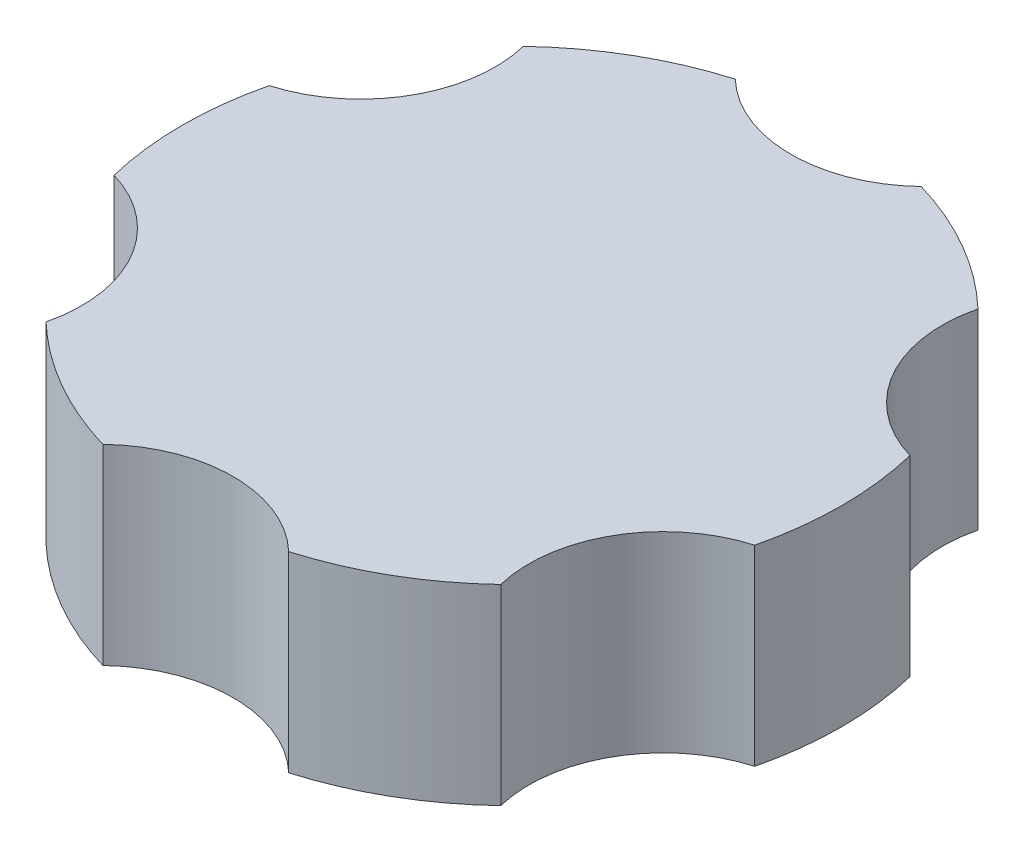
ISO-10303-21;
HEADER;
FILE_DESCRIPTION(('STEP AP214'),'2;1');
FILE_NAME('part.step','',(''),(''),'','','');
FILE_SCHEMA(('AUTOMOTIVE_DESIGN { 1 0 10303 214 1 1 1 1 }'));
ENDSEC;
DATA;
#1=APPLICATION_CONTEXT('core data for automotive mechanical design processes');
#2=APPLICATION_PROTOCOL_DEFINITION('international standard','automotive_design',2000,#1);
#3=PRODUCT_CONTEXT('',#1,'mechanical');
#4=PRODUCT('Part','Part','',(#3));
#5=PRODUCT_RELATED_PRODUCT_CATEGORY('part','',(#4));
#6=PRODUCT_DEFINITION_FORMATION('','',#4);
#7=PRODUCT_DEFINITION_CONTEXT('part definition',#1,'design');
#8=PRODUCT_DEFINITION('design','',#6,#7);
#9=PRODUCT_DEFINITION_SHAPE('','',#8);
#10=(LENGTH_UNIT() NAMED_UNIT(*) SI_UNIT(.MILLI.,.METRE.));
#11=(NAMED_UNIT(*) PLANE_ANGLE_UNIT() SI_UNIT($,.RADIAN.));
#12=(NAMED_UNIT(*) SI_UNIT($,.STERADIAN.) SOLID_ANGLE_UNIT());
#13=UNCERTAINTY_MEASURE_WITH_UNIT(LENGTH_MEASURE(1.E-05),#10,'distance_accuracy_value','');
#14=(GEOMETRIC_REPRESENTATION_CONTEXT(3) GLOBAL_UNCERTAINTY_ASSIGNED_CONTEXT((#13)) GLOBAL_UNIT_ASSIGNED_CONTEXT((#10,
#11,#12)) REPRESENTATION_CONTEXT('',''));
#15=CARTESIAN_POINT('',(0.,0.,0.));
#16=DIRECTION('',(0.,0.,1.));
#17=DIRECTION('',(1.,0.,0.));
#18=AXIS2_PLACEMENT_3D('',#15,#16,#17);
#19=CARTESIAN_POINT('',(0.,17.,0.));
#20=DIRECTION('',(0.,-1.,0.));
#21=DIRECTION('',(0.,0.,-1.));
#22=AXIS2_PLACEMENT_3D('',#19,#20,#21);
#23=CYLINDRICAL_SURFACE('',#22,29.25);
#24=CARTESIAN_POINT('',(0.,0.,0.));
#25=DIRECTION('',(0.,1.,0.));
#26=DIRECTION('',(0.,0.,1.));
#27=AXIS2_PLACEMENT_3D('',#24,#25,#26);
#28=CIRCLE('',#27,29.25);
#29=CARTESIAN_POINT('',(-8.25,0.,-28.0624304008046));
#30=VERTEX_POINT('',#29);
#31=CARTESIAN_POINT('',(-20.1777776190296,0.,-21.1759247816238));
#32=VERTEX_POINT('',#31);
#33=EDGE_CURVE('E153',#30,#32,#28,.T.);
#34=ORIENTED_EDGE('',*,*,#33,.T.);
#35=DIRECTION('',(0.,-1.,0.));
#36=VECTOR('',#35,1.);
#37=CARTESIAN_POINT('',(-20.1777776190296,17.,-21.1759247816238));
#38=LINE('',#37,#36);
#39=CARTESIAN_POINT('',(-20.1777776190296,17.,-21.1759247816238));
#40=VERTEX_POINT('',#39);
#41=EDGE_CURVE('E11',#40,#32,#38,.T.);
#42=ORIENTED_EDGE('',*,*,#41,.F.);
#43=CARTESIAN_POINT('',(0.,17.,0.));
#44=DIRECTION('',(0.,1.,0.));
#45=DIRECTION('',(0.,0.,1.));
#46=AXIS2_PLACEMENT_3D('',#43,#44,#45);
#47=CIRCLE('',#46,29.25);
#48=CARTESIAN_POINT('',(-8.25,17.,-28.0624304008046));
#49=VERTEX_POINT('',#48);
#50=EDGE_CURVE('E175',#49,#40,#47,.T.);
#51=ORIENTED_EDGE('',*,*,#50,.F.);
#52=DIRECTION('',(0.,-1.,0.));
#53=VECTOR('',#52,1.);
#54=CARTESIAN_POINT('',(-8.25,17.,-28.0624304008046));
#55=LINE('',#54,#53);
#56=EDGE_CURVE('E149',#49,#30,#55,.T.);
#57=ORIENTED_EDGE('',*,*,#56,.T.);
#58=EDGE_LOOP('',(#34,#42,#51,#57));
#59=FACE_BOUND('',#58,.T.);
#60=ADVANCED_FACE('F33',(#59),#23,.T.);
#61=CARTESIAN_POINT('',(-31.765825640971,17.,-18.3400079848448));
#62=DIRECTION('',(0.,-1.,0.));
#63=DIRECTION('',(0.,0.,-1.));
#64=AXIS2_PLACEMENT_3D('',#61,#62,#63);
#65=CYLINDRICAL_SURFACE('',#64,11.9300159696906);
#66=CARTESIAN_POINT('',(-31.765825640971,0.,-18.3400079848448));
#67=DIRECTION('',(0.,-1.,0.));
#68=DIRECTION('',(0.,0.,1.));
#69=AXIS2_PLACEMENT_3D('',#66,#67,#68);
#70=CIRCLE('',#69,11.9300159696906);
#71=CARTESIAN_POINT('',(-28.4277776190296,0.,-6.88650561918018));
#72=VERTEX_POINT('',#71);
#73=EDGE_CURVE('E156',#32,#72,#70,.T.);
#74=ORIENTED_EDGE('',*,*,#73,.T.);
#75=DIRECTION('',(0.,-1.,0.));
#76=VECTOR('',#75,1.);
#77=CARTESIAN_POINT('',(-28.4277776190296,17.,-6.88650561918018));
#78=LINE('',#77,#76);
#79=CARTESIAN_POINT('',(-28.4277776190296,17.,-6.88650561918018));
#80=VERTEX_POINT('',#79);
#81=EDGE_CURVE('E41',#80,#72,#78,.T.);
#82=ORIENTED_EDGE('',*,*,#81,.F.);
#83=CARTESIAN_POINT('',(-31.765825640971,17.,-18.3400079848448));
#84=DIRECTION('',(0.,-1.,0.));
#85=DIRECTION('',(0.,0.,1.));
#86=AXIS2_PLACEMENT_3D('',#83,#84,#85);
#87=CIRCLE('',#86,11.9300159696906);
#88=EDGE_CURVE('E104',#40,#80,#87,.T.);
#89=ORIENTED_EDGE('',*,*,#88,.F.);
#90=ORIENTED_EDGE('',*,*,#41,.T.);
#91=EDGE_LOOP('',(#74,#82,#89,#90));
#92=FACE_BOUND('',#91,.T.);
#93=ADVANCED_FACE('F253',(#92),#65,.F.);
#94=CARTESIAN_POINT('',(0.,17.,0.));
#95=DIRECTION('',(0.,-1.,0.));
#96=DIRECTION('',(0.,0.,-1.));
#97=AXIS2_PLACEMENT_3D('',#94,#95,#96);
#98=CYLINDRICAL_SURFACE('',#97,29.25);
#99=CARTESIAN_POINT('',(0.,0.,0.));
#100=DIRECTION('',(0.,1.,0.));
#101=DIRECTION('',(0.,0.,1.));
#102=AXIS2_PLACEMENT_3D('',#99,#100,#101);
#103=CIRCLE('',#102,29.25);
#104=CARTESIAN_POINT('',(-28.4277776190293,0.,6.88650561918127));
#105=VERTEX_POINT('',#104);
#106=EDGE_CURVE('E158',#72,#105,#103,.T.);
#107=ORIENTED_EDGE('',*,*,#106,.T.);
#108=DIRECTION('',(0.,-1.,0.));
#109=VECTOR('',#108,1.);
#110=CARTESIAN_POINT('',(-28.4277776190293,17.,6.88650561918127));
#111=LINE('',#110,#109);
#112=CARTESIAN_POINT('',(-28.4277776190293,17.,6.88650561918127));
#113=VERTEX_POINT('',#112);
#114=EDGE_CURVE('E194',#113,#105,#111,.T.);
#115=ORIENTED_EDGE('',*,*,#114,.F.);
#116=CARTESIAN_POINT('',(0.,17.,0.));
#117=DIRECTION('',(0.,1.,0.));
#118=DIRECTION('',(0.,0.,1.));
#119=AXIS2_PLACEMENT_3D('',#116,#117,#118);
#120=CIRCLE('',#119,29.25);
#121=EDGE_CURVE('E202',#80,#113,#120,.T.);
#122=ORIENTED_EDGE('',*,*,#121,.F.);
#123=ORIENTED_EDGE('',*,*,#81,.T.);
#124=EDGE_LOOP('',(#107,#115,#122,#123));
#125=FACE_BOUND('',#124,.T.);
#126=ADVANCED_FACE('F200',(#125),#98,.T.);
#127=CARTESIAN_POINT('',(-31.7658256409706,17.,18.340007984846));
#128=DIRECTION('',(0.,-1.,0.));
#129=DIRECTION('',(0.,0.,-1.));
#130=AXIS2_PLACEMENT_3D('',#127,#128,#129);
#131=CYLINDRICAL_SURFACE('',#130,11.9300159696906);
#132=CARTESIAN_POINT('',(-31.7658256409706,0.,18.340007984846));
#133=DIRECTION('',(0.,-1.,0.));
#134=DIRECTION('',(0.,0.,1.));
#135=AXIS2_PLACEMENT_3D('',#132,#133,#134);
#136=CIRCLE('',#135,11.9300159696906);
#137=CARTESIAN_POINT('',(-20.177777619029,0.,21.1759247816243));
#138=VERTEX_POINT('',#137);
#139=EDGE_CURVE('E160',#105,#138,#136,.T.);
#140=ORIENTED_EDGE('',*,*,#139,.T.);
#141=DIRECTION('',(0.,-1.,0.));
#142=VECTOR('',#141,1.);
#143=CARTESIAN_POINT('',(-20.177777619029,17.,21.1759247816243));
#144=LINE('',#143,#142);
#145=CARTESIAN_POINT('',(-20.177777619029,17.,21.1759247816243));
#146=VERTEX_POINT('',#145);
#147=EDGE_CURVE('E191',#146,#138,#144,.T.);
#148=ORIENTED_EDGE('',*,*,#147,.F.);
#149=CARTESIAN_POINT('',(-31.7658256409706,17.,18.340007984846));
#150=DIRECTION('',(0.,-1.,0.));
#151=DIRECTION('',(0.,0.,1.));
#152=AXIS2_PLACEMENT_3D('',#149,#150,#151);
#153=CIRCLE('',#152,11.9300159696906);
#154=EDGE_CURVE('E220',#113,#146,#153,.T.);
#155=ORIENTED_EDGE('',*,*,#154,.F.);
#156=ORIENTED_EDGE('',*,*,#114,.T.);
#157=EDGE_LOOP('',(#140,#148,#155,#156));
#158=FACE_BOUND('',#157,.T.);
#159=ADVANCED_FACE('F211',(#158),#131,.F.);
#160=CARTESIAN_POINT('',(0.,17.,0.));
#161=DIRECTION('',(0.,-1.,0.));
#162=DIRECTION('',(0.,0.,-1.));
#163=AXIS2_PLACEMENT_3D('',#160,#161,#162);
#164=CYLINDRICAL_SURFACE('',#163,29.25);
#165=CARTESIAN_POINT('',(0.,0.,0.));
#166=DIRECTION('',(0.,1.,0.));
#167=DIRECTION('',(0.,0.,1.));
#168=AXIS2_PLACEMENT_3D('',#165,#166,#167);
#169=CIRCLE('',#168,29.25);
#170=CARTESIAN_POINT('',(-8.24999999999903,0.,28.0624304008048));
#171=VERTEX_POINT('',#170);
#172=EDGE_CURVE('E162',#138,#171,#169,.T.);
#173=ORIENTED_EDGE('',*,*,#172,.T.);
#174=DIRECTION('',(0.,-1.,0.));
#175=VECTOR('',#174,1.);
#176=CARTESIAN_POINT('',(-8.24999999999903,17.,28.0624304008048));
#177=LINE('',#176,#175);
#178=CARTESIAN_POINT('',(-8.24999999999903,17.,28.0624304008048));
#179=VERTEX_POINT('',#178);
#180=EDGE_CURVE('E188',#179,#171,#177,.T.);
#181=ORIENTED_EDGE('',*,*,#180,.F.);
#182=CARTESIAN_POINT('',(0.,17.,0.));
#183=DIRECTION('',(0.,1.,0.));
#184=DIRECTION('',(0.,0.,1.));
#185=AXIS2_PLACEMENT_3D('',#182,#183,#184);
#186=CIRCLE('',#185,29.25);
#187=EDGE_CURVE('E217',#146,#179,#186,.T.);
#188=ORIENTED_EDGE('',*,*,#187,.F.);
#189=ORIENTED_EDGE('',*,*,#147,.T.);
#190=EDGE_LOOP('',(#173,#181,#188,#189));
#191=FACE_BOUND('',#190,.T.);
#192=ADVANCED_FACE('F215',(#191),#164,.T.);
#193=CARTESIAN_POINT('',(7.78228973605211E-13,17.,36.6800159696911));
#194=DIRECTION('',(0.,-1.,0.));
#195=DIRECTION('',(0.,0.,-1.));
#196=AXIS2_PLACEMENT_3D('',#193,#194,#195);
#197=CYLINDRICAL_SURFACE('',#196,11.9300159696906);
#198=CARTESIAN_POINT('',(7.78228973605211E-13,0.,36.6800159696911));
#199=DIRECTION('',(0.,-1.,0.));
#200=DIRECTION('',(0.,0.,1.));
#201=AXIS2_PLACEMENT_3D('',#198,#199,#200);
#202=CIRCLE('',#201,11.9300159696906);
#203=CARTESIAN_POINT('',(8.25000000000022,0.,28.0624304008045));
#204=VERTEX_POINT('',#203);
#205=EDGE_CURVE('E164',#171,#204,#202,.T.);
#206=ORIENTED_EDGE('',*,*,#205,.T.);
#207=DIRECTION('',(0.,-1.,0.));
#208=VECTOR('',#207,1.);
#209=CARTESIAN_POINT('',(8.25000000000022,17.,28.0624304008045));
#210=LINE('',#209,#208);
#211=CARTESIAN_POINT('',(8.25000000000022,17.,28.0624304008045));
#212=VERTEX_POINT('',#211);
#213=EDGE_CURVE('E185',#212,#204,#210,.T.);
#214=ORIENTED_EDGE('',*,*,#213,.F.);
#215=CARTESIAN_POINT('',(7.78228973605211E-13,17.,36.6800159696911));
#216=DIRECTION('',(0.,-1.,0.));
#217=DIRECTION('',(0.,0.,1.));
#218=AXIS2_PLACEMENT_3D('',#215,#216,#217);
#219=CIRCLE('',#218,11.9300159696906);
#220=EDGE_CURVE('E219',#179,#212,#219,.T.);
#221=ORIENTED_EDGE('',*,*,#220,.F.);
#222=ORIENTED_EDGE('',*,*,#180,.T.);
#223=EDGE_LOOP('',(#206,#214,#221,#222));
#224=FACE_BOUND('',#223,.T.);
#225=ADVANCED_FACE('F266',(#224),#197,.F.);
#226=CARTESIAN_POINT('',(0.,17.,0.));
#227=DIRECTION('',(0.,-1.,0.));
#228=DIRECTION('',(0.,0.,-1.));
#229=AXIS2_PLACEMENT_3D('',#226,#227,#228);
#230=CYLINDRICAL_SURFACE('',#229,29.25);
#231=CARTESIAN_POINT('',(0.,0.,0.));
#232=DIRECTION('',(0.,1.,0.));
#233=DIRECTION('',(0.,0.,1.));
#234=AXIS2_PLACEMENT_3D('',#231,#232,#233);
#235=CIRCLE('',#234,29.25);
#236=CARTESIAN_POINT('',(20.1777776190301,0.,21.1759247816233));
#237=VERTEX_POINT('',#236);
#238=EDGE_CURVE('E166',#204,#237,#235,.T.);
#239=ORIENTED_EDGE('',*,*,#238,.T.);
#240=DIRECTION('',(0.,-1.,0.));
#241=VECTOR('',#240,1.);
#242=CARTESIAN_POINT('',(20.1777776190301,17.,21.1759247816233));
#243=LINE('',#242,#241);
#244=CARTESIAN_POINT('',(20.1777776190301,17.,21.1759247816233));
#245=VERTEX_POINT('',#244);
#246=EDGE_CURVE('E182',#245,#237,#243,.T.);
#247=ORIENTED_EDGE('',*,*,#246,.F.);
#248=CARTESIAN_POINT('',(0.,17.,0.));
#249=DIRECTION('',(0.,1.,0.));
#250=DIRECTION('',(0.,0.,1.));
#251=AXIS2_PLACEMENT_3D('',#248,#249,#250);
#252=CIRCLE('',#251,29.25);
#253=EDGE_CURVE('E222',#212,#245,#252,.T.);
#254=ORIENTED_EDGE('',*,*,#253,.F.);
#255=ORIENTED_EDGE('',*,*,#213,.T.);
#256=EDGE_LOOP('',(#239,#247,#254,#255));
#257=FACE_BOUND('',#256,.T.);
#258=ADVANCED_FACE('F269',(#257),#230,.T.);
#259=CARTESIAN_POINT('',(31.7658256409718,17.,18.3400079848453));
#260=DIRECTION('',(0.,-1.,0.));
#261=DIRECTION('',(0.,0.,-1.));
#262=AXIS2_PLACEMENT_3D('',#259,#260,#261);
#263=CYLINDRICAL_SURFACE('',#262,11.9300159696906);
#264=CARTESIAN_POINT('',(31.7658256409718,0.,18.3400079848453));
#265=DIRECTION('',(0.,-1.,0.));
#266=DIRECTION('',(0.,0.,1.));
#267=AXIS2_PLACEMENT_3D('',#264,#265,#266);
#268=CIRCLE('',#267,11.9300159696906);
#269=CARTESIAN_POINT('',(28.4277776190294,0.,6.88650561918091));
#270=VERTEX_POINT('',#269);
#271=EDGE_CURVE('E168',#237,#270,#268,.T.);
#272=ORIENTED_EDGE('',*,*,#271,.T.);
#273=DIRECTION('',(0.,-1.,0.));
#274=VECTOR('',#273,1.);
#275=CARTESIAN_POINT('',(28.4277776190294,17.,6.88650561918091));
#276=LINE('',#275,#274);
#277=CARTESIAN_POINT('',(28.4277776190294,17.,6.88650561918091));
#278=VERTEX_POINT('',#277);
#279=EDGE_CURVE('E179',#278,#270,#276,.T.);
#280=ORIENTED_EDGE('',*,*,#279,.F.);
#281=CARTESIAN_POINT('',(31.7658256409718,17.,18.3400079848453));
#282=DIRECTION('',(0.,-1.,0.));
#283=DIRECTION('',(0.,0.,1.));
#284=AXIS2_PLACEMENT_3D('',#281,#282,#283);
#285=CIRCLE('',#284,11.9300159696906);
#286=EDGE_CURVE('E228',#245,#278,#285,.T.);
#287=ORIENTED_EDGE('',*,*,#286,.F.);
#288=ORIENTED_EDGE('',*,*,#246,.T.);
#289=EDGE_LOOP('',(#272,#280,#287,#288));
#290=FACE_BOUND('',#289,.T.);
#291=ADVANCED_FACE('F234',(#290),#263,.F.);
#292=CARTESIAN_POINT('',(0.,17.,0.));
#293=DIRECTION('',(0.,-1.,0.));
#294=DIRECTION('',(0.,0.,-1.));
#295=AXIS2_PLACEMENT_3D('',#292,#293,#294);
#296=CYLINDRICAL_SURFACE('',#295,29.25);
#297=CARTESIAN_POINT('',(0.,0.,0.));
#298=DIRECTION('',(0.,1.,0.));
#299=DIRECTION('',(0.,0.,1.));
#300=AXIS2_PLACEMENT_3D('',#297,#298,#299);
#301=CIRCLE('',#300,29.25);
#302=CARTESIAN_POINT('',(28.4277776190294,0.,-6.88650561918104));
#303=VERTEX_POINT('',#302);
#304=EDGE_CURVE('E170',#270,#303,#301,.T.);
#305=ORIENTED_EDGE('',*,*,#304,.T.);
#306=DIRECTION('',(0.,-1.,0.));
#307=VECTOR('',#306,1.);
#308=CARTESIAN_POINT('',(28.4277776190294,17.,-6.88650561918104));
#309=LINE('',#308,#307);
#310=CARTESIAN_POINT('',(28.4277776190294,17.,-6.88650561918104));
#311=VERTEX_POINT('',#310);
#312=EDGE_CURVE('E144',#311,#303,#309,.T.);
#313=ORIENTED_EDGE('',*,*,#312,.F.);
#314=CARTESIAN_POINT('',(0.,17.,0.));
#315=DIRECTION('',(0.,1.,0.));
#316=DIRECTION('',(0.,0.,1.));
#317=AXIS2_PLACEMENT_3D('',#314,#315,#316);
#318=CIRCLE('',#317,29.25);
#319=EDGE_CURVE('E135',#278,#311,#318,.T.);
#320=ORIENTED_EDGE('',*,*,#319,.F.);
#321=ORIENTED_EDGE('',*,*,#279,.T.);
#322=EDGE_LOOP('',(#305,#313,#320,#321));
#323=FACE_BOUND('',#322,.T.);
#324=ADVANCED_FACE('F238',(#323),#296,.T.);
#325=CARTESIAN_POINT('',(31.7658256409714,17.,-18.3400079848455));
#326=DIRECTION('',(0.,-1.,0.));
#327=DIRECTION('',(0.,0.,-1.));
#328=AXIS2_PLACEMENT_3D('',#325,#326,#327);
#329=CYLINDRICAL_SURFACE('',#328,11.9300159696906);
#330=CARTESIAN_POINT('',(31.7658256409714,0.,-18.3400079848455));
#331=DIRECTION('',(0.,-1.,0.));
#332=DIRECTION('',(0.,0.,1.));
#333=AXIS2_PLACEMENT_3D('',#330,#331,#332);
#334=CIRCLE('',#333,11.9300159696906);
#335=CARTESIAN_POINT('',(20.1777776190298,0.,-21.1759247816236));
#336=VERTEX_POINT('',#335);
#337=EDGE_CURVE('E143',#303,#336,#334,.T.);
#338=ORIENTED_EDGE('',*,*,#337,.T.);
#339=DIRECTION('',(0.,-1.,0.));
#340=VECTOR('',#339,1.);
#341=CARTESIAN_POINT('',(20.1777776190298,17.,-21.1759247816236));
#342=LINE('',#341,#340);
#343=CARTESIAN_POINT('',(20.1777776190298,17.,-21.1759247816236));
#344=VERTEX_POINT('',#343);
#345=EDGE_CURVE('E140',#344,#336,#342,.T.);
#346=ORIENTED_EDGE('',*,*,#345,.F.);
#347=CARTESIAN_POINT('',(31.7658256409714,17.,-18.3400079848455));
#348=DIRECTION('',(0.,-1.,0.));
#349=DIRECTION('',(0.,0.,1.));
#350=AXIS2_PLACEMENT_3D('',#347,#348,#349);
#351=CIRCLE('',#350,11.9300159696906);
#352=EDGE_CURVE('E129',#311,#344,#351,.T.);
#353=ORIENTED_EDGE('',*,*,#352,.F.);
#354=ORIENTED_EDGE('',*,*,#312,.T.);
#355=EDGE_LOOP('',(#338,#346,#353,#354));
#356=FACE_BOUND('',#355,.T.);
#357=ADVANCED_FACE('F141',(#356),#329,.F.);
#358=CARTESIAN_POINT('',(0.,17.,0.));
#359=DIRECTION('',(0.,-1.,0.));
#360=DIRECTION('',(0.,0.,-1.));
#361=AXIS2_PLACEMENT_3D('',#358,#359,#360);
#362=CYLINDRICAL_SURFACE('',#361,29.25);
#363=CARTESIAN_POINT('',(0.,0.,0.));
#364=DIRECTION('',(0.,1.,0.));
#365=DIRECTION('',(0.,0.,1.));
#366=AXIS2_PLACEMENT_3D('',#363,#364,#365);
#367=CIRCLE('',#366,29.25);
#368=CARTESIAN_POINT('',(8.25,0.,-28.0624304008046));
#369=VERTEX_POINT('',#368);
#370=EDGE_CURVE('E90',#336,#369,#367,.T.);
#371=ORIENTED_EDGE('',*,*,#370,.T.);
#372=DIRECTION('',(0.,-1.,0.));
#373=VECTOR('',#372,1.);
#374=CARTESIAN_POINT('',(8.25,17.,-28.0624304008046));
#375=LINE('',#374,#373);
#376=CARTESIAN_POINT('',(8.25,17.,-28.0624304008046));
#377=VERTEX_POINT('',#376);
#378=EDGE_CURVE('E145',#377,#369,#375,.T.);
#379=ORIENTED_EDGE('',*,*,#378,.F.);
#380=CARTESIAN_POINT('',(0.,17.,0.));
#381=DIRECTION('',(0.,1.,0.));
#382=DIRECTION('',(0.,0.,1.));
#383=AXIS2_PLACEMENT_3D('',#380,#381,#382);
#384=CIRCLE('',#383,29.25);
#385=EDGE_CURVE('E133',#344,#377,#384,.T.);
#386=ORIENTED_EDGE('',*,*,#385,.F.);
#387=ORIENTED_EDGE('',*,*,#345,.T.);
#388=EDGE_LOOP('',(#371,#379,#386,#387));
#389=FACE_BOUND('',#388,.T.);
#390=ADVANCED_FACE('F147',(#389),#362,.T.);
#391=CARTESIAN_POINT('',(0.,17.,-36.6800159696906));
#392=DIRECTION('',(0.,-1.,0.));
#393=DIRECTION('',(0.,0.,-1.));
#394=AXIS2_PLACEMENT_3D('',#391,#392,#393);
#395=CYLINDRICAL_SURFACE('',#394,11.9300159696906);
#396=CARTESIAN_POINT('',(0.,0.,-36.6800159696906));
#397=DIRECTION('',(0.,-1.,0.));
#398=DIRECTION('',(0.,0.,1.));
#399=AXIS2_PLACEMENT_3D('',#396,#397,#398);
#400=CIRCLE('',#399,11.9300159696906);
#401=EDGE_CURVE('E96',#369,#30,#400,.T.);
#402=ORIENTED_EDGE('',*,*,#401,.T.);
#403=ORIENTED_EDGE('',*,*,#56,.F.);
#404=CARTESIAN_POINT('',(0.,17.,-36.6800159696906));
#405=DIRECTION('',(0.,-1.,0.));
#406=DIRECTION('',(0.,0.,1.));
#407=AXIS2_PLACEMENT_3D('',#404,#405,#406);
#408=CIRCLE('',#407,11.9300159696906);
#409=EDGE_CURVE('E49',#377,#49,#408,.T.);
#410=ORIENTED_EDGE('',*,*,#409,.F.);
#411=ORIENTED_EDGE('',*,*,#378,.T.);
#412=EDGE_LOOP('',(#402,#403,#410,#411));
#413=FACE_BOUND('',#412,.T.);
#414=ADVANCED_FACE('F242',(#413),#395,.F.);
#415=CARTESIAN_POINT('',(-15.8829128204855,17.,-9.17000399242242));
#416=DIRECTION('',(0.,1.,0.));
#417=DIRECTION('',(0.,0.,1.));
#418=AXIS2_PLACEMENT_3D('',#415,#416,#417);
#419=PLANE('',#418);
#420=ORIENTED_EDGE('',*,*,#50,.T.);
#421=ORIENTED_EDGE('',*,*,#88,.T.);
#422=ORIENTED_EDGE('',*,*,#121,.T.);
#423=ORIENTED_EDGE('',*,*,#154,.T.);
#424=ORIENTED_EDGE('',*,*,#187,.T.);
#425=ORIENTED_EDGE('',*,*,#220,.T.);
#426=ORIENTED_EDGE('',*,*,#253,.T.);
#427=ORIENTED_EDGE('',*,*,#286,.T.);
#428=ORIENTED_EDGE('',*,*,#319,.T.);
#429=ORIENTED_EDGE('',*,*,#352,.T.);
#430=ORIENTED_EDGE('',*,*,#385,.T.);
#431=ORIENTED_EDGE('',*,*,#409,.T.);
#432=EDGE_LOOP('',(#420,#421,#422,#423,#424,#425,#426,#427,#428,#429,#430,#431));
#433=FACE_BOUND('',#432,.T.);
#434=ADVANCED_FACE('F131',(#433),#419,.T.);
#435=CARTESIAN_POINT('',(-15.8829128204855,0.,-9.17000399242242));
#436=DIRECTION('',(0.,1.,0.));
#437=DIRECTION('',(0.,0.,1.));
#438=AXIS2_PLACEMENT_3D('',#435,#436,#437);
#439=PLANE('',#438);
#440=ORIENTED_EDGE('',*,*,#33,.F.);
#441=ORIENTED_EDGE('',*,*,#401,.F.);
#442=ORIENTED_EDGE('',*,*,#370,.F.);
#443=ORIENTED_EDGE('',*,*,#337,.F.);
#444=ORIENTED_EDGE('',*,*,#304,.F.);
#445=ORIENTED_EDGE('',*,*,#271,.F.);
#446=ORIENTED_EDGE('',*,*,#238,.F.);
#447=ORIENTED_EDGE('',*,*,#205,.F.);
#448=ORIENTED_EDGE('',*,*,#172,.F.);
#449=ORIENTED_EDGE('',*,*,#139,.F.);
#450=ORIENTED_EDGE('',*,*,#106,.F.);
#451=ORIENTED_EDGE('',*,*,#73,.F.);
#452=EDGE_LOOP('',(#440,#441,#442,#443,#444,#445,#446,#447,#448,#449,#450,#451));
#453=FACE_BOUND('',#452,.T.);
#454=ADVANCED_FACE('F206',(#453),#439,.F.);
#455=CLOSED_SHELL('',(#60,#93,#126,#159,#192,#225,#258,#291,#324,#357,#390,#414,#434,#454));
#456=MANIFOLD_SOLID_BREP('B2',#455);
#457=ADVANCED_BREP_SHAPE_REPRESENTATION('',(#18,#456),#14);
#458=SHAPE_DEFINITION_REPRESENTATION(#9,#457);
ENDSEC;
END-ISO-10303-21;
